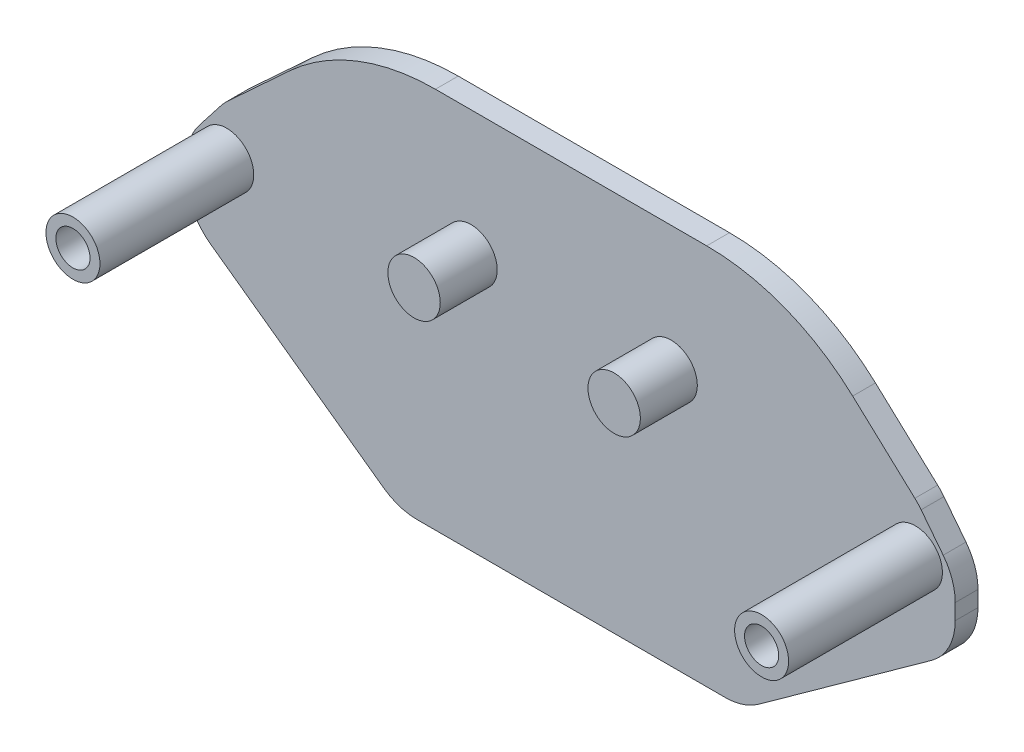
ISO-10303-21;
HEADER;
FILE_DESCRIPTION(('STEP AP214'),'2;1');
FILE_NAME('part.step','',(''),(''),'','','');
FILE_SCHEMA(('AUTOMOTIVE_DESIGN { 1 0 10303 214 1 1 1 1 }'));
ENDSEC;
DATA;
#1=APPLICATION_CONTEXT('core data for automotive mechanical design processes');
#2=APPLICATION_PROTOCOL_DEFINITION('international standard','automotive_design',2000,#1);
#3=PRODUCT_CONTEXT('',#1,'mechanical');
#4=PRODUCT('Part','Part','',(#3));
#5=PRODUCT_RELATED_PRODUCT_CATEGORY('part','',(#4));
#6=PRODUCT_DEFINITION_FORMATION('','',#4);
#7=PRODUCT_DEFINITION_CONTEXT('part definition',#1,'design');
#8=PRODUCT_DEFINITION('design','',#6,#7);
#9=PRODUCT_DEFINITION_SHAPE('','',#8);
#10=(LENGTH_UNIT() NAMED_UNIT(*) SI_UNIT(.MILLI.,.METRE.));
#11=(NAMED_UNIT(*) PLANE_ANGLE_UNIT() SI_UNIT($,.RADIAN.));
#12=(NAMED_UNIT(*) SI_UNIT($,.STERADIAN.) SOLID_ANGLE_UNIT());
#13=UNCERTAINTY_MEASURE_WITH_UNIT(LENGTH_MEASURE(1.E-05),#10,'distance_accuracy_value','');
#14=(GEOMETRIC_REPRESENTATION_CONTEXT(3) GLOBAL_UNCERTAINTY_ASSIGNED_CONTEXT((#13)) GLOBAL_UNIT_ASSIGNED_CONTEXT((#10,
#11,#12)) REPRESENTATION_CONTEXT('',''));
#15=CARTESIAN_POINT('',(0.,0.,0.));
#16=DIRECTION('',(0.,0.,1.));
#17=DIRECTION('',(1.,0.,0.));
#18=AXIS2_PLACEMENT_3D('',#15,#16,#17);
#19=CARTESIAN_POINT('',(0.,0.,2.));
#20=DIRECTION('',(0.,0.,1.));
#21=DIRECTION('',(1.,0.,0.));
#22=AXIS2_PLACEMENT_3D('',#19,#20,#21);
#23=PLANE('',#22);
#24=CARTESIAN_POINT('',(30.2256920152768,2.26835475199135,2.));
#25=DIRECTION('',(0.,0.,1.));
#26=DIRECTION('',(1.,0.,0.));
#27=AXIS2_PLACEMENT_3D('',#24,#25,#26);
#28=CIRCLE('',#27,2.37);
#29=CARTESIAN_POINT('',(32.5956920152768,2.26835475199135,2.));
#30=VERTEX_POINT('',#29);
#31=EDGE_CURVE('E376',#30,#30,#28,.T.);
#32=ORIENTED_EDGE('',*,*,#31,.F.);
#33=EDGE_LOOP('',(#32));
#34=FACE_BOUND('',#33,.T.);
#35=CARTESIAN_POINT('',(8.78206387769159,5.73606331982866,2.));
#36=DIRECTION('',(0.,0.,1.));
#37=DIRECTION('',(1.,0.,0.));
#38=AXIS2_PLACEMENT_3D('',#35,#36,#37);
#39=CIRCLE('',#38,2.29999999999201);
#40=CARTESIAN_POINT('',(11.0820638776836,5.73606331982866,2.));
#41=VERTEX_POINT('',#40);
#42=EDGE_CURVE('E367',#41,#41,#39,.T.);
#43=ORIENTED_EDGE('',*,*,#42,.F.);
#44=EDGE_LOOP('',(#43));
#45=FACE_BOUND('',#44,.T.);
#46=CARTESIAN_POINT('',(-8.78197850298775,5.73606331881914,2.));
#47=DIRECTION('',(0.,0.,1.));
#48=DIRECTION('',(1.,0.,0.));
#49=AXIS2_PLACEMENT_3D('',#46,#47,#48);
#50=CIRCLE('',#49,2.3);
#51=CARTESIAN_POINT('',(-6.48197850298775,5.73606331881914,2.));
#52=VERTEX_POINT('',#51);
#53=EDGE_CURVE('E364',#52,#52,#50,.T.);
#54=ORIENTED_EDGE('',*,*,#53,.F.);
#55=EDGE_LOOP('',(#54));
#56=FACE_BOUND('',#55,.T.);
#57=DIRECTION('',(-1.,0.,0.));
#58=VECTOR('',#57,1.);
#59=CARTESIAN_POINT('',(0.,-16.7612197194001,2.));
#60=LINE('',#59,#58);
#61=CARTESIAN_POINT('',(13.5298261112284,-16.7612197194001,2.));
#62=VERTEX_POINT('',#61);
#63=CARTESIAN_POINT('',(-13.5298261112284,-16.7612197194001,2.));
#64=VERTEX_POINT('',#63);
#65=EDGE_CURVE('E256',#62,#64,#60,.T.);
#66=ORIENTED_EDGE('',*,*,#65,.F.);
#67=CARTESIAN_POINT('',(13.5298261112284,-11.7612197194001,2.));
#68=DIRECTION('',(0.,0.,1.));
#69=DIRECTION('',(1.,0.,0.));
#70=AXIS2_PLACEMENT_3D('',#67,#68,#69);
#71=CIRCLE('',#70,5.);
#72=CARTESIAN_POINT('',(16.4505448278829,-15.8194708425052,2.));
#73=VERTEX_POINT('',#72);
#74=EDGE_CURVE('E315',#73,#62,#71,.F.);
#75=ORIENTED_EDGE('',*,*,#74,.F.);
#76=DIRECTION('',(-0.811650224621027,-0.584143743330901,0.));
#77=VECTOR('',#76,1.);
#78=CARTESIAN_POINT('',(13.1136531263741,-18.2210280040514,2.));
#79=LINE('',#78,#77);
#80=CARTESIAN_POINT('',(31.6405505312914,-4.88724101782946,2.));
#81=VERTEX_POINT('',#80);
#82=EDGE_CURVE('E298',#81,#73,#79,.T.);
#83=ORIENTED_EDGE('',*,*,#82,.F.);
#84=CARTESIAN_POINT('',(28.7198318146369,-0.828989894724323,2.));
#85=DIRECTION('',(0.,0.,1.));
#86=DIRECTION('',(1.,0.,0.));
#87=AXIS2_PLACEMENT_3D('',#84,#85,#86);
#88=CIRCLE('',#87,4.99999999999999);
#89=CARTESIAN_POINT('',(33.7198318146369,-0.828989894724324,2.));
#90=VERTEX_POINT('',#89);
#91=EDGE_CURVE('E312',#90,#81,#88,.F.);
#92=ORIENTED_EDGE('',*,*,#91,.F.);
#93=DIRECTION('',(0.,-1.,0.));
#94=VECTOR('',#93,1.);
#95=CARTESIAN_POINT('',(33.7198318146369,0.,2.));
#96=LINE('',#95,#94);
#97=CARTESIAN_POINT('',(33.7198318146369,0.549989061471458,2.));
#98=VERTEX_POINT('',#97);
#99=EDGE_CURVE('E317',#98,#90,#96,.T.);
#100=ORIENTED_EDGE('',*,*,#99,.F.);
#101=CARTESIAN_POINT('',(28.7198318146369,0.549989061471459,2.));
#102=DIRECTION('',(0.,0.,1.));
#103=DIRECTION('',(1.,0.,0.));
#104=AXIS2_PLACEMENT_3D('',#101,#102,#103);
#105=CIRCLE('',#104,4.99999999999999);
#106=CARTESIAN_POINT('',(32.6634596072953,3.62371641323391,2.));
#107=VERTEX_POINT('',#106);
#108=EDGE_CURVE('E323',#107,#98,#105,.F.);
#109=ORIENTED_EDGE('',*,*,#108,.F.);
#110=DIRECTION('',(0.61474547035249,-0.788725558531671,0.));
#111=VECTOR('',#110,1.);
#112=CARTESIAN_POINT('',(22.0765614201797,17.206829406263,2.));
#113=LINE('',#112,#111);
#114=CARTESIAN_POINT('',(30.7274994020274,6.10757577915898,2.));
#115=VERTEX_POINT('',#114);
#116=EDGE_CURVE('E326',#115,#107,#113,.T.);
#117=ORIENTED_EDGE('',*,*,#116,.F.);
#118=CARTESIAN_POINT('',(26.783871609369,3.03384842739653,2.));
#119=DIRECTION('',(0.,0.,1.));
#120=DIRECTION('',(1.,0.,0.));
#121=AXIS2_PLACEMENT_3D('',#118,#119,#120);
#122=CIRCLE('',#121,4.99999999999999);
#123=CARTESIAN_POINT('',(30.1767465595892,6.70650408402543,2.));
#124=VERTEX_POINT('',#123);
#125=EDGE_CURVE('E329',#124,#115,#122,.F.);
#126=ORIENTED_EDGE('',*,*,#125,.F.);
#127=DIRECTION('',(0.73453113132578,-0.678574990044041,0.));
#128=VECTOR('',#127,1.);
#129=CARTESIAN_POINT('',(17.2380586531619,18.6595305016257,2.));
#130=LINE('',#129,#128);
#131=CARTESIAN_POINT('',(24.7195222721078,11.7480002965302,2.));
#132=VERTEX_POINT('',#131);
#133=EDGE_CURVE('E332',#132,#124,#130,.T.);
#134=ORIENTED_EDGE('',*,*,#133,.F.);
#135=CARTESIAN_POINT('',(11.9050429813657,-2.12317696299234,2.));
#136=DIRECTION('',(0.,0.,1.));
#137=DIRECTION('',(1.,0.,0.));
#138=AXIS2_PLACEMENT_3D('',#135,#136,#137);
#139=CIRCLE('',#138,18.8843966823924);
#140=CARTESIAN_POINT('',(11.9050429813657,16.7612197194001,2.));
#141=VERTEX_POINT('',#140);
#142=EDGE_CURVE('E335',#141,#132,#139,.F.);
#143=ORIENTED_EDGE('',*,*,#142,.F.);
#144=DIRECTION('',(1.,0.,0.));
#145=VECTOR('',#144,1.);
#146=CARTESIAN_POINT('',(0.,16.7612197194001,2.));
#147=LINE('',#146,#145);
#148=CARTESIAN_POINT('',(-11.9050429813657,16.7612197194001,2.));
#149=VERTEX_POINT('',#148);
#150=EDGE_CURVE('E338',#149,#141,#147,.T.);
#151=ORIENTED_EDGE('',*,*,#150,.F.);
#152=CARTESIAN_POINT('',(-11.9050429813657,-2.12317696299234,2.));
#153=DIRECTION('',(0.,0.,1.));
#154=DIRECTION('',(1.,0.,0.));
#155=AXIS2_PLACEMENT_3D('',#152,#153,#154);
#156=CIRCLE('',#155,18.8843966823924);
#157=CARTESIAN_POINT('',(-24.7195222721078,11.7480002965302,2.));
#158=VERTEX_POINT('',#157);
#159=EDGE_CURVE('E341',#149,#158,#156,.T.);
#160=ORIENTED_EDGE('',*,*,#159,.T.);
#161=DIRECTION('',(-0.73453113132578,-0.678574990044041,0.));
#162=VECTOR('',#161,1.);
#163=CARTESIAN_POINT('',(-17.2380586531619,18.6595305016257,2.));
#164=LINE('',#163,#162);
#165=CARTESIAN_POINT('',(-30.1767465595892,6.70650408402542,2.));
#166=VERTEX_POINT('',#165);
#167=EDGE_CURVE('E343',#158,#166,#164,.T.);
#168=ORIENTED_EDGE('',*,*,#167,.T.);
#169=CARTESIAN_POINT('',(-26.783871609369,3.03384842739653,2.));
#170=DIRECTION('',(0.,0.,1.));
#171=DIRECTION('',(1.,0.,0.));
#172=AXIS2_PLACEMENT_3D('',#169,#170,#171);
#173=CIRCLE('',#172,4.99999999999999);
#174=CARTESIAN_POINT('',(-30.7274994020274,6.10757577915897,2.));
#175=VERTEX_POINT('',#174);
#176=EDGE_CURVE('E345',#166,#175,#173,.T.);
#177=ORIENTED_EDGE('',*,*,#176,.T.);
#178=DIRECTION('',(-0.61474547035249,-0.788725558531671,0.));
#179=VECTOR('',#178,1.);
#180=CARTESIAN_POINT('',(-22.0765614201797,17.206829406263,2.));
#181=LINE('',#180,#179);
#182=CARTESIAN_POINT('',(-32.6634596072953,3.6237164132339,2.));
#183=VERTEX_POINT('',#182);
#184=EDGE_CURVE('E347',#175,#183,#181,.T.);
#185=ORIENTED_EDGE('',*,*,#184,.T.);
#186=CARTESIAN_POINT('',(-28.7198318146369,0.549989061471452,2.));
#187=DIRECTION('',(0.,0.,1.));
#188=DIRECTION('',(1.,0.,0.));
#189=AXIS2_PLACEMENT_3D('',#186,#187,#188);
#190=CIRCLE('',#189,5.);
#191=CARTESIAN_POINT('',(-33.7198318146369,0.549989061471451,2.));
#192=VERTEX_POINT('',#191);
#193=EDGE_CURVE('E349',#183,#192,#190,.T.);
#194=ORIENTED_EDGE('',*,*,#193,.T.);
#195=DIRECTION('',(0.,-1.,0.));
#196=VECTOR('',#195,1.);
#197=CARTESIAN_POINT('',(-33.7198318146369,0.,2.));
#198=LINE('',#197,#196);
#199=CARTESIAN_POINT('',(-33.7198318146369,-0.828989894724331,2.));
#200=VERTEX_POINT('',#199);
#201=EDGE_CURVE('E183',#192,#200,#198,.T.);
#202=ORIENTED_EDGE('',*,*,#201,.T.);
#203=CARTESIAN_POINT('',(-28.7198318146369,-0.82898989472433,2.));
#204=DIRECTION('',(0.,0.,1.));
#205=DIRECTION('',(1.,0.,0.));
#206=AXIS2_PLACEMENT_3D('',#203,#204,#205);
#207=CIRCLE('',#206,5.);
#208=CARTESIAN_POINT('',(-31.6405505312914,-4.88724101782946,2.));
#209=VERTEX_POINT('',#208);
#210=EDGE_CURVE('E177',#200,#209,#207,.T.);
#211=ORIENTED_EDGE('',*,*,#210,.T.);
#212=DIRECTION('',(0.811650224621027,-0.5841437433309,0.));
#213=VECTOR('',#212,1.);
#214=CARTESIAN_POINT('',(-13.1136531263741,-18.2210280040514,2.));
#215=LINE('',#214,#213);
#216=CARTESIAN_POINT('',(-16.4505448278829,-15.8194708425052,2.));
#217=VERTEX_POINT('',#216);
#218=EDGE_CURVE('E181',#209,#217,#215,.T.);
#219=ORIENTED_EDGE('',*,*,#218,.T.);
#220=CARTESIAN_POINT('',(-13.5298261112284,-11.7612197194001,2.));
#221=DIRECTION('',(0.,0.,1.));
#222=DIRECTION('',(1.,0.,0.));
#223=AXIS2_PLACEMENT_3D('',#220,#221,#222);
#224=CIRCLE('',#223,5.);
#225=EDGE_CURVE('E52',#217,#64,#224,.T.);
#226=ORIENTED_EDGE('',*,*,#225,.T.);
#227=EDGE_LOOP('',(#66,#75,#83,#92,#100,#109,#117,#126,#134,#143,#151,#160,#168,#177,#185,#194,
#202,#211,#219,#226));
#228=FACE_BOUND('',#227,.T.);
#229=CARTESIAN_POINT('',(-30.2256920152768,2.26835475199134,2.));
#230=DIRECTION('',(0.,0.,1.));
#231=DIRECTION('',(1.,0.,0.));
#232=AXIS2_PLACEMENT_3D('',#229,#230,#231);
#233=CIRCLE('',#232,2.37);
#234=CARTESIAN_POINT('',(-27.8556920152768,2.26835475199134,2.));
#235=VERTEX_POINT('',#234);
#236=EDGE_CURVE('E385',#235,#235,#233,.T.);
#237=ORIENTED_EDGE('',*,*,#236,.F.);
#238=EDGE_LOOP('',(#237));
#239=FACE_BOUND('',#238,.T.);
#240=ADVANCED_FACE('F35',(#34,#45,#56,#228,#239),#23,.T.);
#241=CARTESIAN_POINT('',(0.,-16.7612197194001,2.));
#242=DIRECTION('',(0.,-1.,0.));
#243=DIRECTION('',(0.,0.,-1.));
#244=AXIS2_PLACEMENT_3D('',#241,#242,#243);
#245=PLANE('',#244);
#246=DIRECTION('',(-1.,0.,0.));
#247=VECTOR('',#246,1.);
#248=CARTESIAN_POINT('',(0.,-16.7612197194001,0.));
#249=LINE('',#248,#247);
#250=CARTESIAN_POINT('',(13.5298261112284,-16.7612197194001,0.));
#251=VERTEX_POINT('',#250);
#252=CARTESIAN_POINT('',(-13.5298261112284,-16.7612197194001,0.));
#253=VERTEX_POINT('',#252);
#254=EDGE_CURVE('E200',#251,#253,#249,.T.);
#255=ORIENTED_EDGE('',*,*,#254,.F.);
#256=DIRECTION('',(0.,0.,-1.));
#257=VECTOR('',#256,1.);
#258=CARTESIAN_POINT('',(13.5298261112284,-16.7612197194001,2.));
#259=LINE('',#258,#257);
#260=EDGE_CURVE('E11',#62,#251,#259,.T.);
#261=ORIENTED_EDGE('',*,*,#260,.F.);
#262=ORIENTED_EDGE('',*,*,#65,.T.);
#263=DIRECTION('',(0.,0.,-1.));
#264=VECTOR('',#263,1.);
#265=CARTESIAN_POINT('',(-13.5298261112284,-16.7612197194001,2.));
#266=LINE('',#265,#264);
#267=EDGE_CURVE('E123',#64,#253,#266,.T.);
#268=ORIENTED_EDGE('',*,*,#267,.T.);
#269=EDGE_LOOP('',(#255,#261,#262,#268));
#270=FACE_BOUND('',#269,.T.);
#271=ADVANCED_FACE('F37',(#270),#245,.T.);
#272=CARTESIAN_POINT('',(13.5298261112284,-11.7612197194001,2.));
#273=DIRECTION('',(0.,0.,-1.));
#274=DIRECTION('',(-1.,0.,0.));
#275=AXIS2_PLACEMENT_3D('',#272,#273,#274);
#276=CYLINDRICAL_SURFACE('',#275,5.);
#277=CARTESIAN_POINT('',(13.5298261112284,-11.7612197194001,0.));
#278=DIRECTION('',(0.,0.,1.));
#279=DIRECTION('',(1.,0.,0.));
#280=AXIS2_PLACEMENT_3D('',#277,#278,#279);
#281=CIRCLE('',#280,5.);
#282=CARTESIAN_POINT('',(16.4505448278829,-15.8194708425052,0.));
#283=VERTEX_POINT('',#282);
#284=EDGE_CURVE('E203',#283,#251,#281,.F.);
#285=ORIENTED_EDGE('',*,*,#284,.F.);
#286=DIRECTION('',(0.,0.,-1.));
#287=VECTOR('',#286,1.);
#288=CARTESIAN_POINT('',(16.4505448278829,-15.8194708425052,2.));
#289=LINE('',#288,#287);
#290=EDGE_CURVE('E44',#73,#283,#289,.T.);
#291=ORIENTED_EDGE('',*,*,#290,.F.);
#292=ORIENTED_EDGE('',*,*,#74,.T.);
#293=ORIENTED_EDGE('',*,*,#260,.T.);
#294=EDGE_LOOP('',(#285,#291,#292,#293));
#295=FACE_BOUND('',#294,.T.);
#296=ADVANCED_FACE('F302',(#295),#276,.T.);
#297=CARTESIAN_POINT('',(13.1136531263741,-18.2210280040514,2.));
#298=DIRECTION('',(0.584143743330901,-0.811650224621027,0.));
#299=DIRECTION('',(0.811650224621027,0.584143743330901,0.));
#300=AXIS2_PLACEMENT_3D('',#297,#298,#299);
#301=PLANE('',#300);
#302=DIRECTION('',(-0.811650224621027,-0.584143743330901,0.));
#303=VECTOR('',#302,1.);
#304=CARTESIAN_POINT('',(13.1136531263741,-18.2210280040514,0.));
#305=LINE('',#304,#303);
#306=CARTESIAN_POINT('',(31.6405505312914,-4.88724101782946,0.));
#307=VERTEX_POINT('',#306);
#308=EDGE_CURVE('E207',#307,#283,#305,.T.);
#309=ORIENTED_EDGE('',*,*,#308,.F.);
#310=DIRECTION('',(0.,0.,-1.));
#311=VECTOR('',#310,1.);
#312=CARTESIAN_POINT('',(31.6405505312914,-4.88724101782946,2.));
#313=LINE('',#312,#311);
#314=EDGE_CURVE('E291',#81,#307,#313,.T.);
#315=ORIENTED_EDGE('',*,*,#314,.F.);
#316=ORIENTED_EDGE('',*,*,#82,.T.);
#317=ORIENTED_EDGE('',*,*,#290,.T.);
#318=EDGE_LOOP('',(#309,#315,#316,#317));
#319=FACE_BOUND('',#318,.T.);
#320=ADVANCED_FACE('F296',(#319),#301,.T.);
#321=CARTESIAN_POINT('',(28.7198318146369,-0.828989894724323,2.));
#322=DIRECTION('',(0.,0.,-1.));
#323=DIRECTION('',(-1.,0.,0.));
#324=AXIS2_PLACEMENT_3D('',#321,#322,#323);
#325=CYLINDRICAL_SURFACE('',#324,4.99999999999999);
#326=CARTESIAN_POINT('',(28.7198318146369,-0.828989894724323,0.));
#327=DIRECTION('',(0.,0.,1.));
#328=DIRECTION('',(1.,0.,0.));
#329=AXIS2_PLACEMENT_3D('',#326,#327,#328);
#330=CIRCLE('',#329,4.99999999999999);
#331=CARTESIAN_POINT('',(33.7198318146369,-0.828989894724324,0.));
#332=VERTEX_POINT('',#331);
#333=EDGE_CURVE('E210',#332,#307,#330,.F.);
#334=ORIENTED_EDGE('',*,*,#333,.F.);
#335=DIRECTION('',(0.,0.,-1.));
#336=VECTOR('',#335,1.);
#337=CARTESIAN_POINT('',(33.7198318146369,-0.828989894724324,2.));
#338=LINE('',#337,#336);
#339=EDGE_CURVE('E289',#90,#332,#338,.T.);
#340=ORIENTED_EDGE('',*,*,#339,.F.);
#341=ORIENTED_EDGE('',*,*,#91,.T.);
#342=ORIENTED_EDGE('',*,*,#314,.T.);
#343=EDGE_LOOP('',(#334,#340,#341,#342));
#344=FACE_BOUND('',#343,.T.);
#345=ADVANCED_FACE('F309',(#344),#325,.T.);
#346=CARTESIAN_POINT('',(33.7198318146369,0.,2.));
#347=DIRECTION('',(1.,0.,0.));
#348=DIRECTION('',(0.,0.,-1.));
#349=AXIS2_PLACEMENT_3D('',#346,#347,#348);
#350=PLANE('',#349);
#351=DIRECTION('',(0.,-1.,0.));
#352=VECTOR('',#351,1.);
#353=CARTESIAN_POINT('',(33.7198318146369,0.,0.));
#354=LINE('',#353,#352);
#355=CARTESIAN_POINT('',(33.7198318146369,0.549989061471458,0.));
#356=VERTEX_POINT('',#355);
#357=EDGE_CURVE('E213',#356,#332,#354,.T.);
#358=ORIENTED_EDGE('',*,*,#357,.F.);
#359=DIRECTION('',(0.,0.,-1.));
#360=VECTOR('',#359,1.);
#361=CARTESIAN_POINT('',(33.7198318146369,0.549989061471458,2.));
#362=LINE('',#361,#360);
#363=EDGE_CURVE('E287',#98,#356,#362,.T.);
#364=ORIENTED_EDGE('',*,*,#363,.F.);
#365=ORIENTED_EDGE('',*,*,#99,.T.);
#366=ORIENTED_EDGE('',*,*,#339,.T.);
#367=EDGE_LOOP('',(#358,#364,#365,#366));
#368=FACE_BOUND('',#367,.T.);
#369=ADVANCED_FACE('F481',(#368),#350,.T.);
#370=CARTESIAN_POINT('',(28.7198318146369,0.549989061471459,2.));
#371=DIRECTION('',(0.,0.,-1.));
#372=DIRECTION('',(-1.,0.,0.));
#373=AXIS2_PLACEMENT_3D('',#370,#371,#372);
#374=CYLINDRICAL_SURFACE('',#373,4.99999999999999);
#375=CARTESIAN_POINT('',(28.7198318146369,0.549989061471459,0.));
#376=DIRECTION('',(0.,0.,1.));
#377=DIRECTION('',(1.,0.,0.));
#378=AXIS2_PLACEMENT_3D('',#375,#376,#377);
#379=CIRCLE('',#378,4.99999999999999);
#380=CARTESIAN_POINT('',(32.6634596072953,3.62371641323391,0.));
#381=VERTEX_POINT('',#380);
#382=EDGE_CURVE('E216',#381,#356,#379,.F.);
#383=ORIENTED_EDGE('',*,*,#382,.F.);
#384=DIRECTION('',(0.,0.,-1.));
#385=VECTOR('',#384,1.);
#386=CARTESIAN_POINT('',(32.6634596072953,3.62371641323391,2.));
#387=LINE('',#386,#385);
#388=EDGE_CURVE('E285',#107,#381,#387,.T.);
#389=ORIENTED_EDGE('',*,*,#388,.F.);
#390=ORIENTED_EDGE('',*,*,#108,.T.);
#391=ORIENTED_EDGE('',*,*,#363,.T.);
#392=EDGE_LOOP('',(#383,#389,#390,#391));
#393=FACE_BOUND('',#392,.T.);
#394=ADVANCED_FACE('F477',(#393),#374,.T.);
#395=CARTESIAN_POINT('',(22.0765614201797,17.206829406263,2.));
#396=DIRECTION('',(0.788725558531671,0.61474547035249,0.));
#397=DIRECTION('',(-0.61474547035249,0.788725558531671,0.));
#398=AXIS2_PLACEMENT_3D('',#395,#396,#397);
#399=PLANE('',#398);
#400=DIRECTION('',(0.61474547035249,-0.788725558531671,0.));
#401=VECTOR('',#400,1.);
#402=CARTESIAN_POINT('',(22.0765614201797,17.206829406263,0.));
#403=LINE('',#402,#401);
#404=CARTESIAN_POINT('',(30.7274994020274,6.10757577915898,0.));
#405=VERTEX_POINT('',#404);
#406=EDGE_CURVE('E219',#405,#381,#403,.T.);
#407=ORIENTED_EDGE('',*,*,#406,.F.);
#408=DIRECTION('',(0.,0.,-1.));
#409=VECTOR('',#408,1.);
#410=CARTESIAN_POINT('',(30.7274994020274,6.10757577915898,2.));
#411=LINE('',#410,#409);
#412=EDGE_CURVE('E283',#115,#405,#411,.T.);
#413=ORIENTED_EDGE('',*,*,#412,.F.);
#414=ORIENTED_EDGE('',*,*,#116,.T.);
#415=ORIENTED_EDGE('',*,*,#388,.T.);
#416=EDGE_LOOP('',(#407,#413,#414,#415));
#417=FACE_BOUND('',#416,.T.);
#418=ADVANCED_FACE('F473',(#417),#399,.T.);
#419=CARTESIAN_POINT('',(26.783871609369,3.03384842739653,2.));
#420=DIRECTION('',(0.,0.,-1.));
#421=DIRECTION('',(-1.,0.,0.));
#422=AXIS2_PLACEMENT_3D('',#419,#420,#421);
#423=CYLINDRICAL_SURFACE('',#422,4.99999999999999);
#424=CARTESIAN_POINT('',(26.783871609369,3.03384842739653,0.));
#425=DIRECTION('',(0.,0.,1.));
#426=DIRECTION('',(1.,0.,0.));
#427=AXIS2_PLACEMENT_3D('',#424,#425,#426);
#428=CIRCLE('',#427,4.99999999999999);
#429=CARTESIAN_POINT('',(30.1767465595892,6.70650408402543,0.));
#430=VERTEX_POINT('',#429);
#431=EDGE_CURVE('E222',#430,#405,#428,.F.);
#432=ORIENTED_EDGE('',*,*,#431,.F.);
#433=DIRECTION('',(0.,0.,-1.));
#434=VECTOR('',#433,1.);
#435=CARTESIAN_POINT('',(30.1767465595892,6.70650408402543,2.));
#436=LINE('',#435,#434);
#437=EDGE_CURVE('E281',#124,#430,#436,.T.);
#438=ORIENTED_EDGE('',*,*,#437,.F.);
#439=ORIENTED_EDGE('',*,*,#125,.T.);
#440=ORIENTED_EDGE('',*,*,#412,.T.);
#441=EDGE_LOOP('',(#432,#438,#439,#440));
#442=FACE_BOUND('',#441,.T.);
#443=ADVANCED_FACE('F469',(#442),#423,.T.);
#444=CARTESIAN_POINT('',(17.2380586531619,18.6595305016257,2.));
#445=DIRECTION('',(0.67857499004404,0.73453113132578,0.));
#446=DIRECTION('',(-0.73453113132578,0.678574990044041,0.));
#447=AXIS2_PLACEMENT_3D('',#444,#445,#446);
#448=PLANE('',#447);
#449=DIRECTION('',(0.73453113132578,-0.678574990044041,0.));
#450=VECTOR('',#449,1.);
#451=CARTESIAN_POINT('',(17.2380586531619,18.6595305016257,0.));
#452=LINE('',#451,#450);
#453=CARTESIAN_POINT('',(24.7195222721078,11.7480002965302,0.));
#454=VERTEX_POINT('',#453);
#455=EDGE_CURVE('E225',#454,#430,#452,.T.);
#456=ORIENTED_EDGE('',*,*,#455,.F.);
#457=DIRECTION('',(0.,0.,-1.));
#458=VECTOR('',#457,1.);
#459=CARTESIAN_POINT('',(24.7195222721078,11.7480002965302,2.));
#460=LINE('',#459,#458);
#461=EDGE_CURVE('E279',#132,#454,#460,.T.);
#462=ORIENTED_EDGE('',*,*,#461,.F.);
#463=ORIENTED_EDGE('',*,*,#133,.T.);
#464=ORIENTED_EDGE('',*,*,#437,.T.);
#465=EDGE_LOOP('',(#456,#462,#463,#464));
#466=FACE_BOUND('',#465,.T.);
#467=ADVANCED_FACE('F465',(#466),#448,.T.);
#468=CARTESIAN_POINT('',(11.9050429813657,-2.12317696299234,2.));
#469=DIRECTION('',(0.,0.,-1.));
#470=DIRECTION('',(-1.,0.,0.));
#471=AXIS2_PLACEMENT_3D('',#468,#469,#470);
#472=CYLINDRICAL_SURFACE('',#471,18.8843966823924);
#473=CARTESIAN_POINT('',(11.9050429813657,-2.12317696299234,0.));
#474=DIRECTION('',(0.,0.,1.));
#475=DIRECTION('',(1.,0.,0.));
#476=AXIS2_PLACEMENT_3D('',#473,#474,#475);
#477=CIRCLE('',#476,18.8843966823924);
#478=CARTESIAN_POINT('',(11.9050429813657,16.7612197194001,0.));
#479=VERTEX_POINT('',#478);
#480=EDGE_CURVE('E228',#479,#454,#477,.F.);
#481=ORIENTED_EDGE('',*,*,#480,.F.);
#482=DIRECTION('',(0.,0.,-1.));
#483=VECTOR('',#482,1.);
#484=CARTESIAN_POINT('',(11.9050429813657,16.7612197194001,2.));
#485=LINE('',#484,#483);
#486=EDGE_CURVE('E277',#141,#479,#485,.T.);
#487=ORIENTED_EDGE('',*,*,#486,.F.);
#488=ORIENTED_EDGE('',*,*,#142,.T.);
#489=ORIENTED_EDGE('',*,*,#461,.T.);
#490=EDGE_LOOP('',(#481,#487,#488,#489));
#491=FACE_BOUND('',#490,.T.);
#492=ADVANCED_FACE('F461',(#491),#472,.T.);
#493=CARTESIAN_POINT('',(0.,16.7612197194001,2.));
#494=DIRECTION('',(0.,1.,0.));
#495=DIRECTION('',(-1.,0.,0.));
#496=AXIS2_PLACEMENT_3D('',#493,#494,#495);
#497=PLANE('',#496);
#498=DIRECTION('',(1.,0.,0.));
#499=VECTOR('',#498,1.);
#500=CARTESIAN_POINT('',(0.,16.7612197194001,0.));
#501=LINE('',#500,#499);
#502=CARTESIAN_POINT('',(-11.9050429813657,16.7612197194001,0.));
#503=VERTEX_POINT('',#502);
#504=EDGE_CURVE('E231',#503,#479,#501,.T.);
#505=ORIENTED_EDGE('',*,*,#504,.F.);
#506=DIRECTION('',(0.,0.,-1.));
#507=VECTOR('',#506,1.);
#508=CARTESIAN_POINT('',(-11.9050429813657,16.7612197194001,2.));
#509=LINE('',#508,#507);
#510=EDGE_CURVE('E275',#149,#503,#509,.T.);
#511=ORIENTED_EDGE('',*,*,#510,.F.);
#512=ORIENTED_EDGE('',*,*,#150,.T.);
#513=ORIENTED_EDGE('',*,*,#486,.T.);
#514=EDGE_LOOP('',(#505,#511,#512,#513));
#515=FACE_BOUND('',#514,.T.);
#516=ADVANCED_FACE('F457',(#515),#497,.T.);
#517=CARTESIAN_POINT('',(-11.9050429813657,-2.12317696299234,2.));
#518=DIRECTION('',(0.,0.,-1.));
#519=DIRECTION('',(-1.,0.,0.));
#520=AXIS2_PLACEMENT_3D('',#517,#518,#519);
#521=CYLINDRICAL_SURFACE('',#520,18.8843966823924);
#522=CARTESIAN_POINT('',(-11.9050429813657,-2.12317696299234,0.));
#523=DIRECTION('',(0.,0.,1.));
#524=DIRECTION('',(1.,0.,0.));
#525=AXIS2_PLACEMENT_3D('',#522,#523,#524);
#526=CIRCLE('',#525,18.8843966823924);
#527=CARTESIAN_POINT('',(-24.7195222721078,11.7480002965302,0.));
#528=VERTEX_POINT('',#527);
#529=EDGE_CURVE('E234',#503,#528,#526,.T.);
#530=ORIENTED_EDGE('',*,*,#529,.T.);
#531=DIRECTION('',(0.,0.,-1.));
#532=VECTOR('',#531,1.);
#533=CARTESIAN_POINT('',(-24.7195222721078,11.7480002965302,2.));
#534=LINE('',#533,#532);
#535=EDGE_CURVE('E272',#158,#528,#534,.T.);
#536=ORIENTED_EDGE('',*,*,#535,.F.);
#537=ORIENTED_EDGE('',*,*,#159,.F.);
#538=ORIENTED_EDGE('',*,*,#510,.T.);
#539=EDGE_LOOP('',(#530,#536,#537,#538));
#540=FACE_BOUND('',#539,.T.);
#541=ADVANCED_FACE('F453',(#540),#521,.T.);
#542=CARTESIAN_POINT('',(-17.2380586531619,18.6595305016257,2.));
#543=DIRECTION('',(0.67857499004404,-0.73453113132578,0.));
#544=DIRECTION('',(0.73453113132578,0.678574990044041,0.));
#545=AXIS2_PLACEMENT_3D('',#542,#543,#544);
#546=PLANE('',#545);
#547=DIRECTION('',(-0.73453113132578,-0.678574990044041,0.));
#548=VECTOR('',#547,1.);
#549=CARTESIAN_POINT('',(-17.2380586531619,18.6595305016257,0.));
#550=LINE('',#549,#548);
#551=CARTESIAN_POINT('',(-30.1767465595892,6.70650408402542,0.));
#552=VERTEX_POINT('',#551);
#553=EDGE_CURVE('E236',#528,#552,#550,.T.);
#554=ORIENTED_EDGE('',*,*,#553,.T.);
#555=DIRECTION('',(0.,0.,-1.));
#556=VECTOR('',#555,1.);
#557=CARTESIAN_POINT('',(-30.1767465595892,6.70650408402542,2.));
#558=LINE('',#557,#556);
#559=EDGE_CURVE('E269',#166,#552,#558,.T.);
#560=ORIENTED_EDGE('',*,*,#559,.F.);
#561=ORIENTED_EDGE('',*,*,#167,.F.);
#562=ORIENTED_EDGE('',*,*,#535,.T.);
#563=EDGE_LOOP('',(#554,#560,#561,#562));
#564=FACE_BOUND('',#563,.T.);
#565=ADVANCED_FACE('F449',(#564),#546,.F.);
#566=CARTESIAN_POINT('',(-26.783871609369,3.03384842739653,2.));
#567=DIRECTION('',(0.,0.,-1.));
#568=DIRECTION('',(-1.,0.,0.));
#569=AXIS2_PLACEMENT_3D('',#566,#567,#568);
#570=CYLINDRICAL_SURFACE('',#569,4.99999999999999);
#571=CARTESIAN_POINT('',(-26.783871609369,3.03384842739653,0.));
#572=DIRECTION('',(0.,0.,1.));
#573=DIRECTION('',(1.,0.,0.));
#574=AXIS2_PLACEMENT_3D('',#571,#572,#573);
#575=CIRCLE('',#574,4.99999999999999);
#576=CARTESIAN_POINT('',(-30.7274994020274,6.10757577915897,0.));
#577=VERTEX_POINT('',#576);
#578=EDGE_CURVE('E238',#552,#577,#575,.T.);
#579=ORIENTED_EDGE('',*,*,#578,.T.);
#580=DIRECTION('',(0.,0.,-1.));
#581=VECTOR('',#580,1.);
#582=CARTESIAN_POINT('',(-30.7274994020274,6.10757577915897,2.));
#583=LINE('',#582,#581);
#584=EDGE_CURVE('E266',#175,#577,#583,.T.);
#585=ORIENTED_EDGE('',*,*,#584,.F.);
#586=ORIENTED_EDGE('',*,*,#176,.F.);
#587=ORIENTED_EDGE('',*,*,#559,.T.);
#588=EDGE_LOOP('',(#579,#585,#586,#587));
#589=FACE_BOUND('',#588,.T.);
#590=ADVANCED_FACE('F445',(#589),#570,.T.);
#591=CARTESIAN_POINT('',(-22.0765614201797,17.206829406263,2.));
#592=DIRECTION('',(0.788725558531671,-0.61474547035249,0.));
#593=DIRECTION('',(0.61474547035249,0.788725558531671,0.));
#594=AXIS2_PLACEMENT_3D('',#591,#592,#593);
#595=PLANE('',#594);
#596=DIRECTION('',(-0.61474547035249,-0.788725558531671,0.));
#597=VECTOR('',#596,1.);
#598=CARTESIAN_POINT('',(-22.0765614201797,17.206829406263,0.));
#599=LINE('',#598,#597);
#600=CARTESIAN_POINT('',(-32.6634596072953,3.6237164132339,0.));
#601=VERTEX_POINT('',#600);
#602=EDGE_CURVE('E240',#577,#601,#599,.T.);
#603=ORIENTED_EDGE('',*,*,#602,.T.);
#604=DIRECTION('',(0.,0.,-1.));
#605=VECTOR('',#604,1.);
#606=CARTESIAN_POINT('',(-32.6634596072953,3.6237164132339,2.));
#607=LINE('',#606,#605);
#608=EDGE_CURVE('E263',#183,#601,#607,.T.);
#609=ORIENTED_EDGE('',*,*,#608,.F.);
#610=ORIENTED_EDGE('',*,*,#184,.F.);
#611=ORIENTED_EDGE('',*,*,#584,.T.);
#612=EDGE_LOOP('',(#603,#609,#610,#611));
#613=FACE_BOUND('',#612,.T.);
#614=ADVANCED_FACE('F442',(#613),#595,.F.);
#615=CARTESIAN_POINT('',(-28.7198318146369,0.549989061471452,2.));
#616=DIRECTION('',(0.,0.,-1.));
#617=DIRECTION('',(-1.,0.,0.));
#618=AXIS2_PLACEMENT_3D('',#615,#616,#617);
#619=CYLINDRICAL_SURFACE('',#618,5.);
#620=CARTESIAN_POINT('',(-28.7198318146369,0.549989061471452,0.));
#621=DIRECTION('',(0.,0.,1.));
#622=DIRECTION('',(1.,0.,0.));
#623=AXIS2_PLACEMENT_3D('',#620,#621,#622);
#624=CIRCLE('',#623,5.);
#625=CARTESIAN_POINT('',(-33.7198318146369,0.549989061471451,0.));
#626=VERTEX_POINT('',#625);
#627=EDGE_CURVE('E242',#601,#626,#624,.T.);
#628=ORIENTED_EDGE('',*,*,#627,.T.);
#629=DIRECTION('',(0.,0.,-1.));
#630=VECTOR('',#629,1.);
#631=CARTESIAN_POINT('',(-33.7198318146369,0.549989061471451,2.));
#632=LINE('',#631,#630);
#633=EDGE_CURVE('E260',#192,#626,#632,.T.);
#634=ORIENTED_EDGE('',*,*,#633,.F.);
#635=ORIENTED_EDGE('',*,*,#193,.F.);
#636=ORIENTED_EDGE('',*,*,#608,.T.);
#637=EDGE_LOOP('',(#628,#634,#635,#636));
#638=FACE_BOUND('',#637,.T.);
#639=ADVANCED_FACE('F355',(#638),#619,.T.);
#640=CARTESIAN_POINT('',(-33.7198318146369,0.,2.));
#641=DIRECTION('',(1.,0.,0.));
#642=DIRECTION('',(0.,0.,-1.));
#643=AXIS2_PLACEMENT_3D('',#640,#641,#642);
#644=PLANE('',#643);
#645=DIRECTION('',(0.,-1.,0.));
#646=VECTOR('',#645,1.);
#647=CARTESIAN_POINT('',(-33.7198318146369,0.,0.));
#648=LINE('',#647,#646);
#649=CARTESIAN_POINT('',(-33.7198318146369,-0.828989894724331,0.));
#650=VERTEX_POINT('',#649);
#651=EDGE_CURVE('E244',#626,#650,#648,.T.);
#652=ORIENTED_EDGE('',*,*,#651,.T.);
#653=DIRECTION('',(0.,0.,-1.));
#654=VECTOR('',#653,1.);
#655=CARTESIAN_POINT('',(-33.7198318146369,-0.828989894724331,2.));
#656=LINE('',#655,#654);
#657=EDGE_CURVE('E192',#200,#650,#656,.T.);
#658=ORIENTED_EDGE('',*,*,#657,.F.);
#659=ORIENTED_EDGE('',*,*,#201,.F.);
#660=ORIENTED_EDGE('',*,*,#633,.T.);
#661=EDGE_LOOP('',(#652,#658,#659,#660));
#662=FACE_BOUND('',#661,.T.);
#663=ADVANCED_FACE('F359',(#662),#644,.F.);
#664=CARTESIAN_POINT('',(-28.7198318146369,-0.82898989472433,2.));
#665=DIRECTION('',(0.,0.,-1.));
#666=DIRECTION('',(-1.,0.,0.));
#667=AXIS2_PLACEMENT_3D('',#664,#665,#666);
#668=CYLINDRICAL_SURFACE('',#667,5.);
#669=CARTESIAN_POINT('',(-28.7198318146369,-0.82898989472433,0.));
#670=DIRECTION('',(0.,0.,1.));
#671=DIRECTION('',(1.,0.,0.));
#672=AXIS2_PLACEMENT_3D('',#669,#670,#671);
#673=CIRCLE('',#672,5.);
#674=CARTESIAN_POINT('',(-31.6405505312914,-4.88724101782946,0.));
#675=VERTEX_POINT('',#674);
#676=EDGE_CURVE('E191',#650,#675,#673,.T.);
#677=ORIENTED_EDGE('',*,*,#676,.T.);
#678=DIRECTION('',(0.,0.,-1.));
#679=VECTOR('',#678,1.);
#680=CARTESIAN_POINT('',(-31.6405505312914,-4.88724101782946,2.));
#681=LINE('',#680,#679);
#682=EDGE_CURVE('E188',#209,#675,#681,.T.);
#683=ORIENTED_EDGE('',*,*,#682,.F.);
#684=ORIENTED_EDGE('',*,*,#210,.F.);
#685=ORIENTED_EDGE('',*,*,#657,.T.);
#686=EDGE_LOOP('',(#677,#683,#684,#685));
#687=FACE_BOUND('',#686,.T.);
#688=ADVANCED_FACE('F189',(#687),#668,.T.);
#689=CARTESIAN_POINT('',(-13.1136531263741,-18.2210280040514,2.));
#690=DIRECTION('',(0.5841437433309,0.811650224621027,0.));
#691=DIRECTION('',(-0.811650224621027,0.5841437433309,0.));
#692=AXIS2_PLACEMENT_3D('',#689,#690,#691);
#693=PLANE('',#692);
#694=DIRECTION('',(0.811650224621027,-0.5841437433309,0.));
#695=VECTOR('',#694,1.);
#696=CARTESIAN_POINT('',(-13.1136531263741,-18.2210280040514,0.));
#697=LINE('',#696,#695);
#698=CARTESIAN_POINT('',(-16.4505448278829,-15.8194708425052,0.));
#699=VERTEX_POINT('',#698);
#700=EDGE_CURVE('E116',#675,#699,#697,.T.);
#701=ORIENTED_EDGE('',*,*,#700,.T.);
#702=DIRECTION('',(0.,0.,-1.));
#703=VECTOR('',#702,1.);
#704=CARTESIAN_POINT('',(-16.4505448278829,-15.8194708425052,2.));
#705=LINE('',#704,#703);
#706=EDGE_CURVE('E193',#217,#699,#705,.T.);
#707=ORIENTED_EDGE('',*,*,#706,.F.);
#708=ORIENTED_EDGE('',*,*,#218,.F.);
#709=ORIENTED_EDGE('',*,*,#682,.T.);
#710=EDGE_LOOP('',(#701,#707,#708,#709));
#711=FACE_BOUND('',#710,.T.);
#712=ADVANCED_FACE('F195',(#711),#693,.F.);
#713=CARTESIAN_POINT('',(-30.2256920152768,2.26835475199134,2.));
#714=DIRECTION('',(0.,0.,-1.));
#715=DIRECTION('',(-1.,0.,0.));
#716=AXIS2_PLACEMENT_3D('',#713,#714,#715);
#717=CYLINDRICAL_SURFACE('',#716,1.50000000000001);
#718=CARTESIAN_POINT('',(-30.2256920152768,2.26835475199134,0.));
#719=DIRECTION('',(0.,0.,1.));
#720=DIRECTION('',(1.,0.,0.));
#721=AXIS2_PLACEMENT_3D('',#718,#719,#720);
#722=CIRCLE('',#721,1.50000000000001);
#723=CARTESIAN_POINT('',(-28.7256920152768,2.26835475199134,0.));
#724=VERTEX_POINT('',#723);
#725=EDGE_CURVE('E250',#724,#724,#722,.F.);
#726=ORIENTED_EDGE('',*,*,#725,.T.);
#727=EDGE_LOOP('',(#726));
#728=FACE_BOUND('',#727,.T.);
#729=CARTESIAN_POINT('',(-30.2256920152768,2.26835475199134,15.5));
#730=DIRECTION('',(0.,0.,1.));
#731=DIRECTION('',(1.,0.,0.));
#732=AXIS2_PLACEMENT_3D('',#729,#730,#731);
#733=CIRCLE('',#732,1.50000000000001);
#734=CARTESIAN_POINT('',(-28.7256920152768,2.26835475199134,15.5));
#735=VERTEX_POINT('',#734);
#736=EDGE_CURVE('E388',#735,#735,#733,.T.);
#737=ORIENTED_EDGE('',*,*,#736,.T.);
#738=EDGE_LOOP('',(#737));
#739=FACE_BOUND('',#738,.T.);
#740=ADVANCED_FACE('F394',(#728,#739),#717,.F.);
#741=CARTESIAN_POINT('',(-13.5298261112284,-11.7612197194001,2.));
#742=DIRECTION('',(0.,0.,-1.));
#743=DIRECTION('',(-1.,0.,0.));
#744=AXIS2_PLACEMENT_3D('',#741,#742,#743);
#745=CYLINDRICAL_SURFACE('',#744,5.);
#746=CARTESIAN_POINT('',(-13.5298261112284,-11.7612197194001,0.));
#747=DIRECTION('',(0.,0.,1.));
#748=DIRECTION('',(1.,0.,0.));
#749=AXIS2_PLACEMENT_3D('',#746,#747,#748);
#750=CIRCLE('',#749,5.);
#751=EDGE_CURVE('E248',#699,#253,#750,.T.);
#752=ORIENTED_EDGE('',*,*,#751,.T.);
#753=ORIENTED_EDGE('',*,*,#267,.F.);
#754=ORIENTED_EDGE('',*,*,#225,.F.);
#755=ORIENTED_EDGE('',*,*,#706,.T.);
#756=EDGE_LOOP('',(#752,#753,#754,#755));
#757=FACE_BOUND('',#756,.T.);
#758=ADVANCED_FACE('F362',(#757),#745,.T.);
#759=CARTESIAN_POINT('',(30.2256920152768,2.26835475199135,2.));
#760=DIRECTION('',(0.,0.,-1.));
#761=DIRECTION('',(-1.,0.,0.));
#762=AXIS2_PLACEMENT_3D('',#759,#760,#761);
#763=CYLINDRICAL_SURFACE('',#762,1.50000000000001);
#764=CARTESIAN_POINT('',(30.2256920152768,2.26835475199135,0.));
#765=DIRECTION('',(0.,0.,1.));
#766=DIRECTION('',(1.,0.,0.));
#767=AXIS2_PLACEMENT_3D('',#764,#765,#766);
#768=CIRCLE('',#767,1.50000000000001);
#769=CARTESIAN_POINT('',(31.7256920152768,2.26835475199135,0.));
#770=VERTEX_POINT('',#769);
#771=EDGE_CURVE('E253',#770,#770,#768,.T.);
#772=ORIENTED_EDGE('',*,*,#771,.F.);
#773=EDGE_LOOP('',(#772));
#774=FACE_BOUND('',#773,.T.);
#775=CARTESIAN_POINT('',(30.2256920152768,2.26835475199135,15.5));
#776=DIRECTION('',(0.,0.,1.));
#777=DIRECTION('',(1.,0.,0.));
#778=AXIS2_PLACEMENT_3D('',#775,#776,#777);
#779=CIRCLE('',#778,1.50000000000001);
#780=CARTESIAN_POINT('',(31.7256920152768,2.26835475199135,15.5));
#781=VERTEX_POINT('',#780);
#782=EDGE_CURVE('E379',#781,#781,#779,.T.);
#783=ORIENTED_EDGE('',*,*,#782,.T.);
#784=EDGE_LOOP('',(#783));
#785=FACE_BOUND('',#784,.T.);
#786=ADVANCED_FACE('F425',(#774,#785),#763,.F.);
#787=CARTESIAN_POINT('',(0.,0.,0.));
#788=DIRECTION('',(0.,0.,1.));
#789=DIRECTION('',(1.,0.,0.));
#790=AXIS2_PLACEMENT_3D('',#787,#788,#789);
#791=PLANE('',#790);
#792=ORIENTED_EDGE('',*,*,#254,.T.);
#793=ORIENTED_EDGE('',*,*,#751,.F.);
#794=ORIENTED_EDGE('',*,*,#700,.F.);
#795=ORIENTED_EDGE('',*,*,#676,.F.);
#796=ORIENTED_EDGE('',*,*,#651,.F.);
#797=ORIENTED_EDGE('',*,*,#627,.F.);
#798=ORIENTED_EDGE('',*,*,#602,.F.);
#799=ORIENTED_EDGE('',*,*,#578,.F.);
#800=ORIENTED_EDGE('',*,*,#553,.F.);
#801=ORIENTED_EDGE('',*,*,#529,.F.);
#802=ORIENTED_EDGE('',*,*,#504,.T.);
#803=ORIENTED_EDGE('',*,*,#480,.T.);
#804=ORIENTED_EDGE('',*,*,#455,.T.);
#805=ORIENTED_EDGE('',*,*,#431,.T.);
#806=ORIENTED_EDGE('',*,*,#406,.T.);
#807=ORIENTED_EDGE('',*,*,#382,.T.);
#808=ORIENTED_EDGE('',*,*,#357,.T.);
#809=ORIENTED_EDGE('',*,*,#333,.T.);
#810=ORIENTED_EDGE('',*,*,#308,.T.);
#811=ORIENTED_EDGE('',*,*,#284,.T.);
#812=EDGE_LOOP('',(#792,#793,#794,#795,#796,#797,#798,#799,#800,#801,#802,#803,#804,#805,#806,
#807,#808,#809,#810,#811));
#813=FACE_BOUND('',#812,.T.);
#814=ORIENTED_EDGE('',*,*,#725,.F.);
#815=EDGE_LOOP('',(#814));
#816=FACE_BOUND('',#815,.T.);
#817=ORIENTED_EDGE('',*,*,#771,.T.);
#818=EDGE_LOOP('',(#817));
#819=FACE_BOUND('',#818,.T.);
#820=ADVANCED_FACE('F304',(#813,#816,#819),#791,.F.);
#821=CARTESIAN_POINT('',(-8.78197850298775,5.73606331881914,7.));
#822=DIRECTION('',(0.,0.,-1.));
#823=DIRECTION('',(-1.,0.,0.));
#824=AXIS2_PLACEMENT_3D('',#821,#822,#823);
#825=CYLINDRICAL_SURFACE('',#824,2.3);
#826=CARTESIAN_POINT('',(-8.78197850298775,5.73606331881914,7.));
#827=DIRECTION('',(0.,0.,1.));
#828=DIRECTION('',(1.,0.,0.));
#829=AXIS2_PLACEMENT_3D('',#826,#827,#828);
#830=CIRCLE('',#829,2.3);
#831=CARTESIAN_POINT('',(-6.48197850298775,5.73606331881914,7.));
#832=VERTEX_POINT('',#831);
#833=EDGE_CURVE('E204',#832,#832,#830,.T.);
#834=ORIENTED_EDGE('',*,*,#833,.F.);
#835=EDGE_LOOP('',(#834));
#836=FACE_BOUND('',#835,.T.);
#837=ORIENTED_EDGE('',*,*,#53,.T.);
#838=EDGE_LOOP('',(#837));
#839=FACE_BOUND('',#838,.T.);
#840=ADVANCED_FACE('F421',(#836,#839),#825,.T.);
#841=CARTESIAN_POINT('',(-8.78197850298775,5.73606331881914,7.));
#842=DIRECTION('',(0.,0.,1.));
#843=DIRECTION('',(1.,0.,0.));
#844=AXIS2_PLACEMENT_3D('',#841,#842,#843);
#845=PLANE('',#844);
#846=ORIENTED_EDGE('',*,*,#833,.T.);
#847=EDGE_LOOP('',(#846));
#848=FACE_BOUND('',#847,.T.);
#849=ADVANCED_FACE('F585',(#848),#845,.T.);
#850=CARTESIAN_POINT('',(8.78206387769159,5.73606331982866,7.));
#851=DIRECTION('',(0.,0.,-1.));
#852=DIRECTION('',(-1.,0.,0.));
#853=AXIS2_PLACEMENT_3D('',#850,#851,#852);
#854=CYLINDRICAL_SURFACE('',#853,2.29999999999201);
#855=CARTESIAN_POINT('',(8.78206387769159,5.73606331982866,7.));
#856=DIRECTION('',(0.,0.,1.));
#857=DIRECTION('',(1.,0.,0.));
#858=AXIS2_PLACEMENT_3D('',#855,#856,#857);
#859=CIRCLE('',#858,2.29999999999201);
#860=CARTESIAN_POINT('',(11.0820638776836,5.73606331982866,7.));
#861=VERTEX_POINT('',#860);
#862=EDGE_CURVE('E370',#861,#861,#859,.T.);
#863=ORIENTED_EDGE('',*,*,#862,.F.);
#864=EDGE_LOOP('',(#863));
#865=FACE_BOUND('',#864,.T.);
#866=ORIENTED_EDGE('',*,*,#42,.T.);
#867=EDGE_LOOP('',(#866));
#868=FACE_BOUND('',#867,.T.);
#869=ADVANCED_FACE('F592',(#865,#868),#854,.T.);
#870=CARTESIAN_POINT('',(8.78206387769159,5.73606331982866,7.));
#871=DIRECTION('',(0.,0.,1.));
#872=DIRECTION('',(1.,0.,0.));
#873=AXIS2_PLACEMENT_3D('',#870,#871,#872);
#874=PLANE('',#873);
#875=ORIENTED_EDGE('',*,*,#862,.T.);
#876=EDGE_LOOP('',(#875));
#877=FACE_BOUND('',#876,.T.);
#878=ADVANCED_FACE('F599',(#877),#874,.T.);
#879=CARTESIAN_POINT('',(30.2256920152768,2.26835475199135,15.5));
#880=DIRECTION('',(0.,0.,1.));
#881=DIRECTION('',(1.,0.,0.));
#882=AXIS2_PLACEMENT_3D('',#879,#880,#881);
#883=PLANE('',#882);
#884=CARTESIAN_POINT('',(30.2256920152768,2.26835475199135,15.5));
#885=DIRECTION('',(0.,0.,1.));
#886=DIRECTION('',(1.,0.,0.));
#887=AXIS2_PLACEMENT_3D('',#884,#885,#886);
#888=CIRCLE('',#887,2.37);
#889=CARTESIAN_POINT('',(32.5956920152768,2.26835475199135,15.5));
#890=VERTEX_POINT('',#889);
#891=EDGE_CURVE('E373',#890,#890,#888,.T.);
#892=ORIENTED_EDGE('',*,*,#891,.T.);
#893=EDGE_LOOP('',(#892));
#894=FACE_BOUND('',#893,.T.);
#895=ORIENTED_EDGE('',*,*,#782,.F.);
#896=EDGE_LOOP('',(#895));
#897=FACE_BOUND('',#896,.T.);
#898=ADVANCED_FACE('F408',(#894,#897),#883,.T.);
#899=CARTESIAN_POINT('',(30.2256920152768,2.26835475199135,15.5));
#900=DIRECTION('',(0.,0.,-1.));
#901=DIRECTION('',(-1.,0.,0.));
#902=AXIS2_PLACEMENT_3D('',#899,#900,#901);
#903=CYLINDRICAL_SURFACE('',#902,2.37);
#904=ORIENTED_EDGE('',*,*,#891,.F.);
#905=EDGE_LOOP('',(#904));
#906=FACE_BOUND('',#905,.T.);
#907=ORIENTED_EDGE('',*,*,#31,.T.);
#908=EDGE_LOOP('',(#907));
#909=FACE_BOUND('',#908,.T.);
#910=ADVANCED_FACE('F399',(#906,#909),#903,.T.);
#911=CARTESIAN_POINT('',(-30.2256920152768,2.26835475199134,15.5));
#912=DIRECTION('',(0.,0.,1.));
#913=DIRECTION('',(1.,0.,0.));
#914=AXIS2_PLACEMENT_3D('',#911,#912,#913);
#915=PLANE('',#914);
#916=CARTESIAN_POINT('',(-30.2256920152768,2.26835475199134,15.5));
#917=DIRECTION('',(0.,0.,1.));
#918=DIRECTION('',(1.,0.,0.));
#919=AXIS2_PLACEMENT_3D('',#916,#917,#918);
#920=CIRCLE('',#919,2.37);
#921=CARTESIAN_POINT('',(-27.8556920152768,2.26835475199134,15.5));
#922=VERTEX_POINT('',#921);
#923=EDGE_CURVE('E384',#922,#922,#920,.T.);
#924=ORIENTED_EDGE('',*,*,#923,.T.);
#925=EDGE_LOOP('',(#924));
#926=FACE_BOUND('',#925,.T.);
#927=ORIENTED_EDGE('',*,*,#736,.F.);
#928=EDGE_LOOP('',(#927));
#929=FACE_BOUND('',#928,.T.);
#930=ADVANCED_FACE('F396',(#926,#929),#915,.T.);
#931=CARTESIAN_POINT('',(-30.2256920152768,2.26835475199134,15.5));
#932=DIRECTION('',(0.,0.,-1.));
#933=DIRECTION('',(-1.,0.,0.));
#934=AXIS2_PLACEMENT_3D('',#931,#932,#933);
#935=CYLINDRICAL_SURFACE('',#934,2.37);
#936=ORIENTED_EDGE('',*,*,#923,.F.);
#937=EDGE_LOOP('',(#936));
#938=FACE_BOUND('',#937,.T.);
#939=ORIENTED_EDGE('',*,*,#236,.T.);
#940=EDGE_LOOP('',(#939));
#941=FACE_BOUND('',#940,.T.);
#942=ADVANCED_FACE('F398',(#938,#941),#935,.T.);
#943=CLOSED_SHELL('',(#240,#271,#296,#320,#345,#369,#394,#418,#443,#467,#492,#516,#541,#565,
#590,#614,#639,#663,#688,#712,#740,#758,#786,#820,#840,#849,#869,#878,#898,#910,#930,#942));
#944=MANIFOLD_SOLID_BREP('B2',#943);
#945=ADVANCED_BREP_SHAPE_REPRESENTATION('',(#18,#944),#14);
#946=SHAPE_DEFINITION_REPRESENTATION(#9,#945);
ENDSEC;
END-ISO-10303-21;
